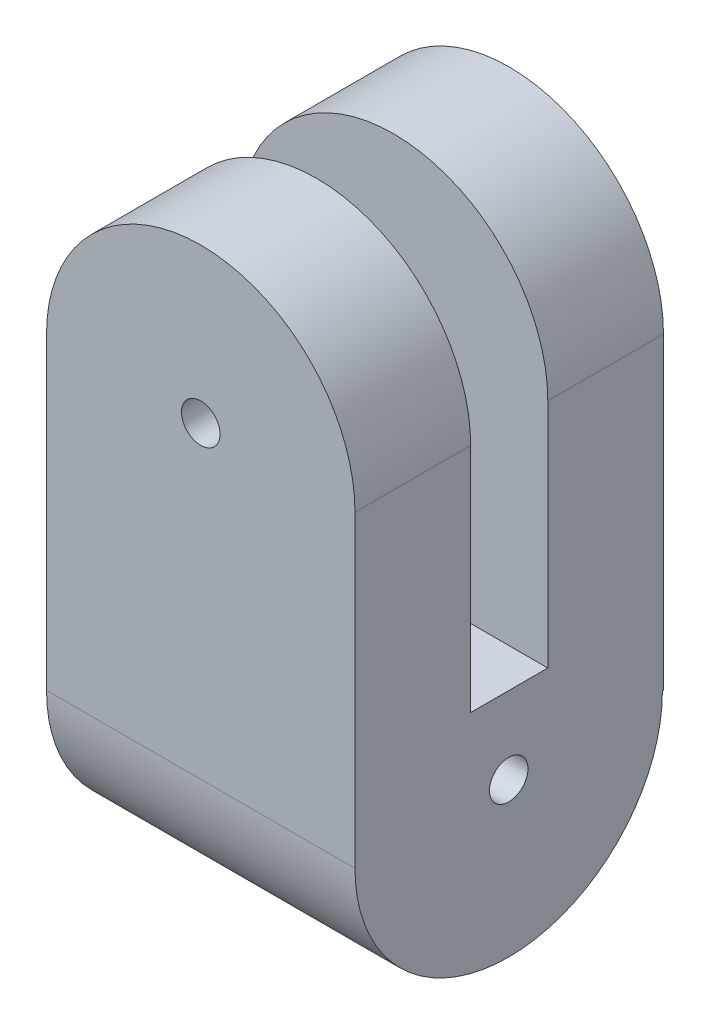
ISO-10303-21;
HEADER;
FILE_DESCRIPTION(('STEP AP214'),'2;1');
FILE_NAME('part.step','',(''),(''),'','','');
FILE_SCHEMA(('AUTOMOTIVE_DESIGN { 1 0 10303 214 1 1 1 1 }'));
ENDSEC;
DATA;
#1=APPLICATION_CONTEXT('core data for automotive mechanical design processes');
#2=APPLICATION_PROTOCOL_DEFINITION('international standard','automotive_design',2000,#1);
#3=PRODUCT_CONTEXT('',#1,'mechanical');
#4=PRODUCT('Part','Part','',(#3));
#5=PRODUCT_RELATED_PRODUCT_CATEGORY('part','',(#4));
#6=PRODUCT_DEFINITION_FORMATION('','',#4);
#7=PRODUCT_DEFINITION_CONTEXT('part definition',#1,'design');
#8=PRODUCT_DEFINITION('design','',#6,#7);
#9=PRODUCT_DEFINITION_SHAPE('','',#8);
#10=(LENGTH_UNIT() NAMED_UNIT(*) SI_UNIT(.MILLI.,.METRE.));
#11=(NAMED_UNIT(*) PLANE_ANGLE_UNIT() SI_UNIT($,.RADIAN.));
#12=(NAMED_UNIT(*) SI_UNIT($,.STERADIAN.) SOLID_ANGLE_UNIT());
#13=UNCERTAINTY_MEASURE_WITH_UNIT(LENGTH_MEASURE(1.E-05),#10,'distance_accuracy_value','');
#14=(GEOMETRIC_REPRESENTATION_CONTEXT(3) GLOBAL_UNCERTAINTY_ASSIGNED_CONTEXT((#13)) GLOBAL_UNIT_ASSIGNED_CONTEXT((#10,
#11,#12)) REPRESENTATION_CONTEXT('',''));
#15=CARTESIAN_POINT('',(0.,0.,0.));
#16=DIRECTION('',(0.,0.,1.));
#17=DIRECTION('',(1.,0.,0.));
#18=AXIS2_PLACEMENT_3D('',#15,#16,#17);
#19=CARTESIAN_POINT('',(0.,5.,10.));
#20=DIRECTION('',(0.,0.,-1.));
#21=DIRECTION('',(-1.,0.,0.));
#22=AXIS2_PLACEMENT_3D('',#19,#20,#21);
#23=CYLINDRICAL_SURFACE('',#22,10.);
#24=DIRECTION('',(0.,0.,-1.));
#25=VECTOR('',#24,1.);
#26=CARTESIAN_POINT('',(10.,5.,10.));
#27=LINE('',#26,#25);
#28=CARTESIAN_POINT('',(10.,5.,10.));
#29=VERTEX_POINT('',#28);
#30=CARTESIAN_POINT('',(10.,5.,2.5));
#31=VERTEX_POINT('',#30);
#32=EDGE_CURVE('E136',#29,#31,#27,.T.);
#33=ORIENTED_EDGE('',*,*,#32,.T.);
#34=CARTESIAN_POINT('',(0.,5.,2.5));
#35=DIRECTION('',(0.,0.,1.));
#36=DIRECTION('',(0.,-1.,0.));
#37=AXIS2_PLACEMENT_3D('',#34,#35,#36);
#38=CIRCLE('',#37,10.);
#39=CARTESIAN_POINT('',(-10.,5.,2.5));
#40=VERTEX_POINT('',#39);
#41=EDGE_CURVE('E11',#31,#40,#38,.T.);
#42=ORIENTED_EDGE('',*,*,#41,.T.);
#43=DIRECTION('',(0.,0.,-1.));
#44=VECTOR('',#43,1.);
#45=CARTESIAN_POINT('',(-10.,5.,10.));
#46=LINE('',#45,#44);
#47=CARTESIAN_POINT('',(-10.,5.,10.));
#48=VERTEX_POINT('',#47);
#49=EDGE_CURVE('E141',#48,#40,#46,.T.);
#50=ORIENTED_EDGE('',*,*,#49,.F.);
#51=CARTESIAN_POINT('',(0.,5.,10.));
#52=DIRECTION('',(0.,0.,1.));
#53=DIRECTION('',(1.,0.,0.));
#54=AXIS2_PLACEMENT_3D('',#51,#52,#53);
#55=CIRCLE('',#54,10.);
#56=EDGE_CURVE('E51',#29,#48,#55,.T.);
#57=ORIENTED_EDGE('',*,*,#56,.F.);
#58=EDGE_LOOP('',(#33,#42,#50,#57));
#59=FACE_BOUND('',#58,.T.);
#60=ADVANCED_FACE('F33',(#59),#23,.T.);
#61=CARTESIAN_POINT('',(-10.,-15.,10.));
#62=DIRECTION('',(1.,0.,0.));
#63=DIRECTION('',(0.,0.,-1.));
#64=AXIS2_PLACEMENT_3D('',#61,#62,#63);
#65=PLANE('',#64);
#66=CARTESIAN_POINT('',(-10.,-15.,0.0337399690693019));
#67=DIRECTION('',(1.,0.,0.));
#68=DIRECTION('',(0.,0.,-1.));
#69=AXIS2_PLACEMENT_3D('',#66,#67,#68);
#70=CIRCLE('',#69,1.25);
#71=CARTESIAN_POINT('',(-10.,-15.,-1.2162600309307));
#72=VERTEX_POINT('',#71);
#73=EDGE_CURVE('E185',#72,#72,#70,.T.);
#74=ORIENTED_EDGE('',*,*,#73,.T.);
#75=EDGE_LOOP('',(#74));
#76=FACE_BOUND('',#75,.T.);
#77=ORIENTED_EDGE('',*,*,#49,.T.);
#78=DIRECTION('',(0.,-1.,0.));
#79=VECTOR('',#78,1.);
#80=CARTESIAN_POINT('',(-10.,15.,2.5));
#81=LINE('',#80,#79);
#82=CARTESIAN_POINT('',(-10.,-10.,2.5));
#83=VERTEX_POINT('',#82);
#84=EDGE_CURVE('E165',#40,#83,#81,.T.);
#85=ORIENTED_EDGE('',*,*,#84,.T.);
#86=DIRECTION('',(0.,0.,-1.));
#87=VECTOR('',#86,1.);
#88=CARTESIAN_POINT('',(-10.,-10.,2.5));
#89=LINE('',#88,#87);
#90=CARTESIAN_POINT('',(-10.,-10.,-2.5));
#91=VERTEX_POINT('',#90);
#92=EDGE_CURVE('E173',#83,#91,#89,.T.);
#93=ORIENTED_EDGE('',*,*,#92,.T.);
#94=DIRECTION('',(0.,1.,0.));
#95=VECTOR('',#94,1.);
#96=CARTESIAN_POINT('',(-10.,15.,-2.5));
#97=LINE('',#96,#95);
#98=CARTESIAN_POINT('',(-10.,5.,-2.5));
#99=VERTEX_POINT('',#98);
#100=EDGE_CURVE('E160',#91,#99,#97,.T.);
#101=ORIENTED_EDGE('',*,*,#100,.T.);
#102=CARTESIAN_POINT('',(-10.,5.,-10.));
#103=VERTEX_POINT('',#102);
#104=EDGE_CURVE('E76',#99,#103,#46,.T.);
#105=ORIENTED_EDGE('',*,*,#104,.T.);
#106=DIRECTION('',(0.,-1.,0.));
#107=VECTOR('',#106,1.);
#108=CARTESIAN_POINT('',(-10.,-15.,-10.));
#109=LINE('',#108,#107);
#110=CARTESIAN_POINT('',(-10.,-15.,-10.));
#111=VERTEX_POINT('',#110);
#112=EDGE_CURVE('E133',#103,#111,#109,.T.);
#113=ORIENTED_EDGE('',*,*,#112,.T.);
#114=DIRECTION('',(0.,0.,-1.));
#115=VECTOR('',#114,1.);
#116=CARTESIAN_POINT('',(-10.,-15.,10.));
#117=LINE('',#116,#115);
#118=CARTESIAN_POINT('',(-10.,-15.,-9.9325200618614));
#119=VERTEX_POINT('',#118);
#120=EDGE_CURVE('E126',#119,#111,#117,.T.);
#121=ORIENTED_EDGE('',*,*,#120,.F.);
#122=CARTESIAN_POINT('',(-10.,-15.,0.0337399690693019));
#123=DIRECTION('',(1.,0.,0.));
#124=DIRECTION('',(0.,0.,-1.));
#125=AXIS2_PLACEMENT_3D('',#122,#123,#124);
#126=CIRCLE('',#125,9.9662600309307);
#127=CARTESIAN_POINT('',(-10.,-15.,10.));
#128=VERTEX_POINT('',#127);
#129=EDGE_CURVE('E114',#128,#119,#126,.T.);
#130=ORIENTED_EDGE('',*,*,#129,.F.);
#131=DIRECTION('',(0.,-1.,0.));
#132=VECTOR('',#131,1.);
#133=CARTESIAN_POINT('',(-10.,-15.,10.));
#134=LINE('',#133,#132);
#135=EDGE_CURVE('E145',#48,#128,#134,.T.);
#136=ORIENTED_EDGE('',*,*,#135,.F.);
#137=EDGE_LOOP('',(#77,#85,#93,#101,#105,#113,#121,#130,#136));
#138=FACE_BOUND('',#137,.T.);
#139=ADVANCED_FACE('F35',(#76,#138),#65,.F.);
#140=CARTESIAN_POINT('',(-10.,-15.,10.));
#141=DIRECTION('',(0.,1.,0.));
#142=DIRECTION('',(0.,0.,1.));
#143=AXIS2_PLACEMENT_3D('',#140,#141,#142);
#144=PLANE('',#143);
#145=DIRECTION('',(0.,0.,-1.));
#146=VECTOR('',#145,1.);
#147=CARTESIAN_POINT('',(10.,-15.,10.));
#148=LINE('',#147,#146);
#149=CARTESIAN_POINT('',(10.,-15.,-9.9325200618614));
#150=VERTEX_POINT('',#149);
#151=CARTESIAN_POINT('',(10.,-15.,-10.));
#152=VERTEX_POINT('',#151);
#153=EDGE_CURVE('E128',#150,#152,#148,.T.);
#154=ORIENTED_EDGE('',*,*,#153,.F.);
#155=DIRECTION('',(1.,0.,0.));
#156=VECTOR('',#155,1.);
#157=CARTESIAN_POINT('',(-10.,-15.,-9.9325200618614));
#158=LINE('',#157,#156);
#159=EDGE_CURVE('E117',#119,#150,#158,.T.);
#160=ORIENTED_EDGE('',*,*,#159,.F.);
#161=ORIENTED_EDGE('',*,*,#120,.T.);
#162=DIRECTION('',(1.,0.,0.));
#163=VECTOR('',#162,1.);
#164=CARTESIAN_POINT('',(-10.,-15.,-10.));
#165=LINE('',#164,#163);
#166=EDGE_CURVE('E148',#111,#152,#165,.T.);
#167=ORIENTED_EDGE('',*,*,#166,.T.);
#168=EDGE_LOOP('',(#154,#160,#161,#167));
#169=FACE_BOUND('',#168,.T.);
#170=ADVANCED_FACE('F124',(#169),#144,.F.);
#171=CARTESIAN_POINT('',(10.,-15.,10.));
#172=DIRECTION('',(-1.,0.,0.));
#173=DIRECTION('',(0.,0.,1.));
#174=AXIS2_PLACEMENT_3D('',#171,#172,#173);
#175=PLANE('',#174);
#176=CARTESIAN_POINT('',(10.,-15.,0.0337399690693019));
#177=DIRECTION('',(1.,0.,0.));
#178=DIRECTION('',(0.,0.,-1.));
#179=AXIS2_PLACEMENT_3D('',#176,#177,#178);
#180=CIRCLE('',#179,1.25);
#181=CARTESIAN_POINT('',(10.,-15.,-1.2162600309307));
#182=VERTEX_POINT('',#181);
#183=EDGE_CURVE('E187',#182,#182,#180,.T.);
#184=ORIENTED_EDGE('',*,*,#183,.F.);
#185=EDGE_LOOP('',(#184));
#186=FACE_BOUND('',#185,.T.);
#187=DIRECTION('',(0.,0.,-1.));
#188=VECTOR('',#187,1.);
#189=CARTESIAN_POINT('',(10.,-10.,2.5));
#190=LINE('',#189,#188);
#191=CARTESIAN_POINT('',(10.,-10.,2.5));
#192=VERTEX_POINT('',#191);
#193=CARTESIAN_POINT('',(10.,-10.,-2.5));
#194=VERTEX_POINT('',#193);
#195=EDGE_CURVE('E166',#192,#194,#190,.T.);
#196=ORIENTED_EDGE('',*,*,#195,.F.);
#197=DIRECTION('',(0.,-1.,0.));
#198=VECTOR('',#197,1.);
#199=CARTESIAN_POINT('',(10.,15.,2.5));
#200=LINE('',#199,#198);
#201=EDGE_CURVE('E169',#31,#192,#200,.T.);
#202=ORIENTED_EDGE('',*,*,#201,.F.);
#203=ORIENTED_EDGE('',*,*,#32,.F.);
#204=DIRECTION('',(0.,1.,0.));
#205=VECTOR('',#204,1.);
#206=CARTESIAN_POINT('',(10.,-15.,10.));
#207=LINE('',#206,#205);
#208=CARTESIAN_POINT('',(10.,-15.,10.));
#209=VERTEX_POINT('',#208);
#210=EDGE_CURVE('E153',#209,#29,#207,.T.);
#211=ORIENTED_EDGE('',*,*,#210,.F.);
#212=CARTESIAN_POINT('',(10.,-15.,0.0337399690693019));
#213=DIRECTION('',(1.,0.,0.));
#214=DIRECTION('',(0.,0.,-1.));
#215=AXIS2_PLACEMENT_3D('',#212,#213,#214);
#216=CIRCLE('',#215,9.9662600309307);
#217=EDGE_CURVE('E82',#209,#150,#216,.T.);
#218=ORIENTED_EDGE('',*,*,#217,.T.);
#219=ORIENTED_EDGE('',*,*,#153,.T.);
#220=DIRECTION('',(0.,1.,0.));
#221=VECTOR('',#220,1.);
#222=CARTESIAN_POINT('',(10.,-15.,-10.));
#223=LINE('',#222,#221);
#224=CARTESIAN_POINT('',(10.,5.,-10.));
#225=VERTEX_POINT('',#224);
#226=EDGE_CURVE('E146',#152,#225,#223,.T.);
#227=ORIENTED_EDGE('',*,*,#226,.T.);
#228=CARTESIAN_POINT('',(10.,5.,-2.5));
#229=VERTEX_POINT('',#228);
#230=EDGE_CURVE('E69',#229,#225,#27,.T.);
#231=ORIENTED_EDGE('',*,*,#230,.F.);
#232=DIRECTION('',(0.,1.,0.));
#233=VECTOR('',#232,1.);
#234=CARTESIAN_POINT('',(10.,15.,-2.5));
#235=LINE('',#234,#233);
#236=EDGE_CURVE('E162',#194,#229,#235,.T.);
#237=ORIENTED_EDGE('',*,*,#236,.F.);
#238=EDGE_LOOP('',(#196,#202,#203,#211,#218,#219,#227,#231,#237));
#239=FACE_BOUND('',#238,.T.);
#240=ADVANCED_FACE('F200',(#186,#239),#175,.F.);
#241=CARTESIAN_POINT('',(0.,5.,-2.5));
#242=DIRECTION('',(0.,0.,-1.));
#243=DIRECTION('',(0.,1.,0.));
#244=AXIS2_PLACEMENT_3D('',#241,#242,#243);
#245=CIRCLE('',#244,10.);
#246=EDGE_CURVE('E43',#99,#229,#245,.T.);
#247=ORIENTED_EDGE('',*,*,#246,.T.);
#248=ORIENTED_EDGE('',*,*,#230,.T.);
#249=CARTESIAN_POINT('',(0.,5.,-10.));
#250=DIRECTION('',(0.,0.,1.));
#251=DIRECTION('',(1.,0.,0.));
#252=AXIS2_PLACEMENT_3D('',#249,#250,#251);
#253=CIRCLE('',#252,10.);
#254=EDGE_CURVE('E143',#225,#103,#253,.T.);
#255=ORIENTED_EDGE('',*,*,#254,.T.);
#256=ORIENTED_EDGE('',*,*,#104,.F.);
#257=EDGE_LOOP('',(#247,#248,#255,#256));
#258=FACE_BOUND('',#257,.T.);
#259=ADVANCED_FACE('F203',(#258),#23,.T.);
#260=CARTESIAN_POINT('',(0.,5.,10.));
#261=DIRECTION('',(0.,0.,1.));
#262=DIRECTION('',(1.,0.,0.));
#263=AXIS2_PLACEMENT_3D('',#260,#261,#262);
#264=PLANE('',#263);
#265=CARTESIAN_POINT('',(0.,5.,10.));
#266=DIRECTION('',(0.,0.,1.));
#267=DIRECTION('',(1.,0.,0.));
#268=AXIS2_PLACEMENT_3D('',#265,#266,#267);
#269=CIRCLE('',#268,1.25);
#270=CARTESIAN_POINT('',(1.25,5.,10.));
#271=VERTEX_POINT('',#270);
#272=EDGE_CURVE('E129',#271,#271,#269,.T.);
#273=ORIENTED_EDGE('',*,*,#272,.F.);
#274=EDGE_LOOP('',(#273));
#275=FACE_BOUND('',#274,.T.);
#276=ORIENTED_EDGE('',*,*,#135,.T.);
#277=DIRECTION('',(1.,0.,0.));
#278=VECTOR('',#277,1.);
#279=CARTESIAN_POINT('',(-10.,-15.,10.));
#280=LINE('',#279,#278);
#281=EDGE_CURVE('E118',#128,#209,#280,.T.);
#282=ORIENTED_EDGE('',*,*,#281,.T.);
#283=ORIENTED_EDGE('',*,*,#210,.T.);
#284=ORIENTED_EDGE('',*,*,#56,.T.);
#285=EDGE_LOOP('',(#276,#282,#283,#284));
#286=FACE_BOUND('',#285,.T.);
#287=ADVANCED_FACE('F216',(#275,#286),#264,.T.);
#288=CARTESIAN_POINT('',(0.,5.,-10.));
#289=DIRECTION('',(0.,0.,1.));
#290=DIRECTION('',(1.,0.,0.));
#291=AXIS2_PLACEMENT_3D('',#288,#289,#290);
#292=PLANE('',#291);
#293=CARTESIAN_POINT('',(0.,5.,-10.));
#294=DIRECTION('',(0.,0.,1.));
#295=DIRECTION('',(1.,0.,0.));
#296=AXIS2_PLACEMENT_3D('',#293,#294,#295);
#297=CIRCLE('',#296,1.25);
#298=CARTESIAN_POINT('',(1.25,5.,-10.));
#299=VERTEX_POINT('',#298);
#300=EDGE_CURVE('E182',#299,#299,#297,.T.);
#301=ORIENTED_EDGE('',*,*,#300,.T.);
#302=EDGE_LOOP('',(#301));
#303=FACE_BOUND('',#302,.T.);
#304=ORIENTED_EDGE('',*,*,#112,.F.);
#305=ORIENTED_EDGE('',*,*,#254,.F.);
#306=ORIENTED_EDGE('',*,*,#226,.F.);
#307=ORIENTED_EDGE('',*,*,#166,.F.);
#308=EDGE_LOOP('',(#304,#305,#306,#307));
#309=FACE_BOUND('',#308,.T.);
#310=ADVANCED_FACE('F221',(#303,#309),#292,.F.);
#311=CARTESIAN_POINT('',(-10.,15.,2.5));
#312=DIRECTION('',(0.,0.,1.));
#313=DIRECTION('',(0.,-1.,0.));
#314=AXIS2_PLACEMENT_3D('',#311,#312,#313);
#315=PLANE('',#314);
#316=CARTESIAN_POINT('',(0.,5.,2.5));
#317=DIRECTION('',(0.,0.,1.));
#318=DIRECTION('',(0.,-1.,0.));
#319=AXIS2_PLACEMENT_3D('',#316,#317,#318);
#320=CIRCLE('',#319,1.25);
#321=CARTESIAN_POINT('',(0.,3.75,2.5));
#322=VERTEX_POINT('',#321);
#323=EDGE_CURVE('E171',#322,#322,#320,.T.);
#324=ORIENTED_EDGE('',*,*,#323,.T.);
#325=EDGE_LOOP('',(#324));
#326=FACE_BOUND('',#325,.T.);
#327=ORIENTED_EDGE('',*,*,#201,.T.);
#328=DIRECTION('',(1.,0.,0.));
#329=VECTOR('',#328,1.);
#330=CARTESIAN_POINT('',(-10.,-10.,2.5));
#331=LINE('',#330,#329);
#332=EDGE_CURVE('E157',#83,#192,#331,.T.);
#333=ORIENTED_EDGE('',*,*,#332,.F.);
#334=ORIENTED_EDGE('',*,*,#84,.F.);
#335=ORIENTED_EDGE('',*,*,#41,.F.);
#336=EDGE_LOOP('',(#327,#333,#334,#335));
#337=FACE_BOUND('',#336,.T.);
#338=ADVANCED_FACE('F214',(#326,#337),#315,.F.);
#339=CARTESIAN_POINT('',(-10.,15.,-2.5));
#340=DIRECTION('',(0.,0.,-1.));
#341=DIRECTION('',(0.,1.,0.));
#342=AXIS2_PLACEMENT_3D('',#339,#340,#341);
#343=PLANE('',#342);
#344=CARTESIAN_POINT('',(0.,5.,-2.5));
#345=DIRECTION('',(0.,0.,-1.));
#346=DIRECTION('',(0.,1.,0.));
#347=AXIS2_PLACEMENT_3D('',#344,#345,#346);
#348=CIRCLE('',#347,1.25);
#349=CARTESIAN_POINT('',(0.,6.25,-2.5));
#350=VERTEX_POINT('',#349);
#351=EDGE_CURVE('E37',#350,#350,#348,.T.);
#352=ORIENTED_EDGE('',*,*,#351,.T.);
#353=EDGE_LOOP('',(#352));
#354=FACE_BOUND('',#353,.T.);
#355=ORIENTED_EDGE('',*,*,#246,.F.);
#356=ORIENTED_EDGE('',*,*,#100,.F.);
#357=DIRECTION('',(1.,0.,0.));
#358=VECTOR('',#357,1.);
#359=CARTESIAN_POINT('',(-10.,-10.,-2.5));
#360=LINE('',#359,#358);
#361=EDGE_CURVE('E151',#91,#194,#360,.T.);
#362=ORIENTED_EDGE('',*,*,#361,.T.);
#363=ORIENTED_EDGE('',*,*,#236,.T.);
#364=EDGE_LOOP('',(#355,#356,#362,#363));
#365=FACE_BOUND('',#364,.T.);
#366=ADVANCED_FACE('F223',(#354,#365),#343,.F.);
#367=CARTESIAN_POINT('',(-10.,-10.,2.5));
#368=DIRECTION('',(0.,-1.,0.));
#369=DIRECTION('',(0.,0.,-1.));
#370=AXIS2_PLACEMENT_3D('',#367,#368,#369);
#371=PLANE('',#370);
#372=ORIENTED_EDGE('',*,*,#195,.T.);
#373=ORIENTED_EDGE('',*,*,#361,.F.);
#374=ORIENTED_EDGE('',*,*,#92,.F.);
#375=ORIENTED_EDGE('',*,*,#332,.T.);
#376=EDGE_LOOP('',(#372,#373,#374,#375));
#377=FACE_BOUND('',#376,.T.);
#378=ADVANCED_FACE('F210',(#377),#371,.F.);
#379=CARTESIAN_POINT('',(0.,5.,-10.));
#380=DIRECTION('',(0.,0.,1.));
#381=DIRECTION('',(1.,0.,0.));
#382=AXIS2_PLACEMENT_3D('',#379,#380,#381);
#383=CYLINDRICAL_SURFACE('',#382,1.25);
#384=ORIENTED_EDGE('',*,*,#300,.F.);
#385=EDGE_LOOP('',(#384));
#386=FACE_BOUND('',#385,.T.);
#387=ORIENTED_EDGE('',*,*,#351,.F.);
#388=EDGE_LOOP('',(#387));
#389=FACE_BOUND('',#388,.T.);
#390=ADVANCED_FACE('F231',(#386,#389),#383,.F.);
#391=ORIENTED_EDGE('',*,*,#272,.T.);
#392=EDGE_LOOP('',(#391));
#393=FACE_BOUND('',#392,.T.);
#394=ORIENTED_EDGE('',*,*,#323,.F.);
#395=EDGE_LOOP('',(#394));
#396=FACE_BOUND('',#395,.T.);
#397=ADVANCED_FACE('F255',(#393,#396),#383,.F.);
#398=CARTESIAN_POINT('',(-10.,-15.,0.0337399690693019));
#399=DIRECTION('',(1.,0.,0.));
#400=DIRECTION('',(0.,0.,-1.));
#401=AXIS2_PLACEMENT_3D('',#398,#399,#400);
#402=CYLINDRICAL_SURFACE('',#401,9.9662600309307);
#403=ORIENTED_EDGE('',*,*,#217,.F.);
#404=ORIENTED_EDGE('',*,*,#281,.F.);
#405=ORIENTED_EDGE('',*,*,#129,.T.);
#406=ORIENTED_EDGE('',*,*,#159,.T.);
#407=EDGE_LOOP('',(#403,#404,#405,#406));
#408=FACE_BOUND('',#407,.T.);
#409=ADVANCED_FACE('F116',(#408),#402,.T.);
#410=CARTESIAN_POINT('',(-10.,-15.,0.0337399690693019));
#411=DIRECTION('',(1.,0.,0.));
#412=DIRECTION('',(0.,0.,-1.));
#413=AXIS2_PLACEMENT_3D('',#410,#411,#412);
#414=CYLINDRICAL_SURFACE('',#413,1.25);
#415=ORIENTED_EDGE('',*,*,#73,.F.);
#416=EDGE_LOOP('',(#415));
#417=FACE_BOUND('',#416,.T.);
#418=ORIENTED_EDGE('',*,*,#183,.T.);
#419=EDGE_LOOP('',(#418));
#420=FACE_BOUND('',#419,.T.);
#421=ADVANCED_FACE('F194',(#417,#420),#414,.F.);
#422=CLOSED_SHELL('',(#60,#139,#170,#240,#259,#287,#310,#338,#366,#378,#390,#397,#409,#421));
#423=MANIFOLD_SOLID_BREP('B2',#422);
#424=ADVANCED_BREP_SHAPE_REPRESENTATION('',(#18,#423),#14);
#425=SHAPE_DEFINITION_REPRESENTATION(#9,#424);
ENDSEC;
END-ISO-10303-21;
